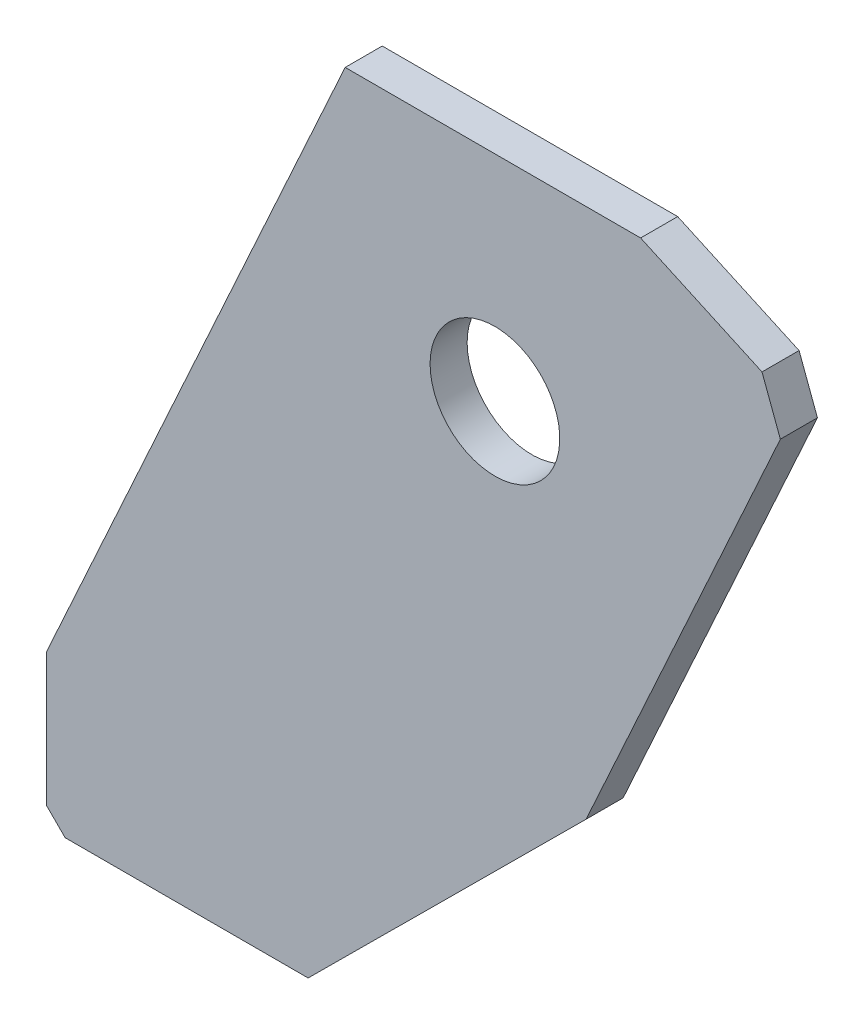
ISO-10303-21;
HEADER;
FILE_DESCRIPTION(('STEP AP214'),'2;1');
FILE_NAME('part.step','',(''),(''),'','','');
FILE_SCHEMA(('AUTOMOTIVE_DESIGN { 1 0 10303 214 1 1 1 1 }'));
ENDSEC;
DATA;
#1=APPLICATION_CONTEXT('core data for automotive mechanical design processes');
#2=APPLICATION_PROTOCOL_DEFINITION('international standard','automotive_design',2000,#1);
#3=PRODUCT_CONTEXT('',#1,'mechanical');
#4=PRODUCT('Part','Part','',(#3));
#5=PRODUCT_RELATED_PRODUCT_CATEGORY('part','',(#4));
#6=PRODUCT_DEFINITION_FORMATION('','',#4);
#7=PRODUCT_DEFINITION_CONTEXT('part definition',#1,'design');
#8=PRODUCT_DEFINITION('design','',#6,#7);
#9=PRODUCT_DEFINITION_SHAPE('','',#8);
#10=(LENGTH_UNIT() NAMED_UNIT(*) SI_UNIT(.MILLI.,.METRE.));
#11=(NAMED_UNIT(*) PLANE_ANGLE_UNIT() SI_UNIT($,.RADIAN.));
#12=(NAMED_UNIT(*) SI_UNIT($,.STERADIAN.) SOLID_ANGLE_UNIT());
#13=UNCERTAINTY_MEASURE_WITH_UNIT(LENGTH_MEASURE(1.E-05),#10,'distance_accuracy_value','');
#14=(GEOMETRIC_REPRESENTATION_CONTEXT(3) GLOBAL_UNCERTAINTY_ASSIGNED_CONTEXT((#13)) GLOBAL_UNIT_ASSIGNED_CONTEXT((#10,
#11,#12)) REPRESENTATION_CONTEXT('',''));
#15=CARTESIAN_POINT('',(0.,0.,0.));
#16=DIRECTION('',(0.,0.,1.));
#17=DIRECTION('',(1.,0.,0.));
#18=AXIS2_PLACEMENT_3D('',#15,#16,#17);
#19=CARTESIAN_POINT('',(-158.542296849365,-28.6070715600615,10.));
#20=DIRECTION('',(1.,0.,0.));
#21=DIRECTION('',(0.,1.,0.));
#22=AXIS2_PLACEMENT_3D('',#19,#20,#21);
#23=PLANE('',#22);
#24=DIRECTION('',(0.,-1.,0.));
#25=VECTOR('',#24,1.);
#26=CARTESIAN_POINT('',(-158.542296849365,-28.6070715600615,0.));
#27=LINE('',#26,#25);
#28=CARTESIAN_POINT('',(-158.542296849365,-28.6070715600615,0.));
#29=VERTEX_POINT('',#28);
#30=CARTESIAN_POINT('',(-158.542296849365,-64.6070715600615,0.));
#31=VERTEX_POINT('',#30);
#32=EDGE_CURVE('E133',#29,#31,#27,.T.);
#33=ORIENTED_EDGE('',*,*,#32,.T.);
#34=DIRECTION('',(0.,0.,-1.));
#35=VECTOR('',#34,1.);
#36=CARTESIAN_POINT('',(-158.542296849365,-64.6070715600615,10.));
#37=LINE('',#36,#35);
#38=CARTESIAN_POINT('',(-158.542296849365,-64.6070715600615,10.));
#39=VERTEX_POINT('',#38);
#40=EDGE_CURVE('E40',#39,#31,#37,.T.);
#41=ORIENTED_EDGE('',*,*,#40,.F.);
#42=DIRECTION('',(0.,-1.,0.));
#43=VECTOR('',#42,1.);
#44=CARTESIAN_POINT('',(-158.542296849365,-28.6070715600615,10.));
#45=LINE('',#44,#43);
#46=CARTESIAN_POINT('',(-158.542296849365,-28.6070715600615,10.));
#47=VERTEX_POINT('',#46);
#48=EDGE_CURVE('E91',#47,#39,#45,.T.);
#49=ORIENTED_EDGE('',*,*,#48,.F.);
#50=DIRECTION('',(0.,0.,-1.));
#51=VECTOR('',#50,1.);
#52=CARTESIAN_POINT('',(-158.542296849365,-28.6070715600615,10.));
#53=LINE('',#52,#51);
#54=EDGE_CURVE('E11',#47,#29,#53,.T.);
#55=ORIENTED_EDGE('',*,*,#54,.T.);
#56=EDGE_LOOP('',(#33,#41,#49,#55));
#57=FACE_BOUND('',#56,.T.);
#58=ADVANCED_FACE('F33',(#57),#23,.F.);
#59=CARTESIAN_POINT('',(-158.542296849365,-64.6070715600615,10.));
#60=DIRECTION('',(0.707106781186548,0.707106781186548,0.));
#61=DIRECTION('',(-0.707106781186548,0.707106781186548,0.));
#62=AXIS2_PLACEMENT_3D('',#59,#60,#61);
#63=PLANE('',#62);
#64=DIRECTION('',(0.707106781186547,-0.707106781186547,0.));
#65=VECTOR('',#64,1.);
#66=CARTESIAN_POINT('',(-158.542296849365,-64.6070715600615,0.));
#67=LINE('',#66,#65);
#68=CARTESIAN_POINT('',(-153.542296849365,-69.6070715600615,0.));
#69=VERTEX_POINT('',#68);
#70=EDGE_CURVE('E135',#31,#69,#67,.T.);
#71=ORIENTED_EDGE('',*,*,#70,.T.);
#72=DIRECTION('',(0.,0.,-1.));
#73=VECTOR('',#72,1.);
#74=CARTESIAN_POINT('',(-153.542296849365,-69.6070715600615,10.));
#75=LINE('',#74,#73);
#76=CARTESIAN_POINT('',(-153.542296849365,-69.6070715600615,10.));
#77=VERTEX_POINT('',#76);
#78=EDGE_CURVE('E152',#77,#69,#75,.T.);
#79=ORIENTED_EDGE('',*,*,#78,.F.);
#80=DIRECTION('',(0.707106781186547,-0.707106781186547,0.));
#81=VECTOR('',#80,1.);
#82=CARTESIAN_POINT('',(-158.542296849365,-64.6070715600615,10.));
#83=LINE('',#82,#81);
#84=EDGE_CURVE('E160',#39,#77,#83,.T.);
#85=ORIENTED_EDGE('',*,*,#84,.F.);
#86=ORIENTED_EDGE('',*,*,#40,.T.);
#87=EDGE_LOOP('',(#71,#79,#85,#86));
#88=FACE_BOUND('',#87,.T.);
#89=ADVANCED_FACE('F158',(#88),#63,.F.);
#90=CARTESIAN_POINT('',(-153.542296849365,-69.6070715600615,10.));
#91=DIRECTION('',(0.,1.,0.));
#92=DIRECTION('',(0.,0.,1.));
#93=AXIS2_PLACEMENT_3D('',#90,#91,#92);
#94=PLANE('',#93);
#95=DIRECTION('',(1.,0.,0.));
#96=VECTOR('',#95,1.);
#97=CARTESIAN_POINT('',(-153.542296849365,-69.6070715600615,0.));
#98=LINE('',#97,#96);
#99=CARTESIAN_POINT('',(-87.9543613891868,-69.6070715600615,0.));
#100=VERTEX_POINT('',#99);
#101=EDGE_CURVE('E138',#69,#100,#98,.T.);
#102=ORIENTED_EDGE('',*,*,#101,.T.);
#103=DIRECTION('',(0.,0.,-1.));
#104=VECTOR('',#103,1.);
#105=CARTESIAN_POINT('',(-87.9543613891868,-69.6070715600615,10.));
#106=LINE('',#105,#104);
#107=CARTESIAN_POINT('',(-87.9543613891868,-69.6070715600615,10.));
#108=VERTEX_POINT('',#107);
#109=EDGE_CURVE('E122',#108,#100,#106,.T.);
#110=ORIENTED_EDGE('',*,*,#109,.F.);
#111=DIRECTION('',(1.,0.,0.));
#112=VECTOR('',#111,1.);
#113=CARTESIAN_POINT('',(-153.542296849365,-69.6070715600615,10.));
#114=LINE('',#113,#112);
#115=EDGE_CURVE('E110',#77,#108,#114,.T.);
#116=ORIENTED_EDGE('',*,*,#115,.F.);
#117=ORIENTED_EDGE('',*,*,#78,.T.);
#118=EDGE_LOOP('',(#102,#110,#116,#117));
#119=FACE_BOUND('',#118,.T.);
#120=ADVANCED_FACE('F169',(#119),#94,.F.);
#121=CARTESIAN_POINT('',(-12.9366779558897,5.0022140777101,10.));
#122=DIRECTION('',(-0.705174149124853,0.709034145444378,0.));
#123=DIRECTION('',(-0.709034145444378,-0.705174149124853,0.));
#124=AXIS2_PLACEMENT_3D('',#121,#122,#123);
#125=PLANE('',#124);
#126=DIRECTION('',(0.709034145444378,0.705174149124853,0.));
#127=VECTOR('',#126,1.);
#128=CARTESIAN_POINT('',(-12.9366779558897,5.0022140777101,0.));
#129=LINE('',#128,#127);
#130=CARTESIAN_POINT('',(-12.9366779558897,5.0022140777101,0.));
#131=VERTEX_POINT('',#130);
#132=EDGE_CURVE('E119',#100,#131,#129,.T.);
#133=ORIENTED_EDGE('',*,*,#132,.T.);
#134=DIRECTION('',(0.,0.,-1.));
#135=VECTOR('',#134,1.);
#136=CARTESIAN_POINT('',(-12.9366779558897,5.0022140777101,10.));
#137=LINE('',#136,#135);
#138=CARTESIAN_POINT('',(-12.9366779558897,5.0022140777101,10.));
#139=VERTEX_POINT('',#138);
#140=EDGE_CURVE('E116',#139,#131,#137,.T.);
#141=ORIENTED_EDGE('',*,*,#140,.F.);
#142=DIRECTION('',(0.709034145444378,0.705174149124853,0.));
#143=VECTOR('',#142,1.);
#144=CARTESIAN_POINT('',(-12.9366779558897,5.0022140777101,10.));
#145=LINE('',#144,#143);
#146=EDGE_CURVE('E102',#108,#139,#145,.T.);
#147=ORIENTED_EDGE('',*,*,#146,.F.);
#148=ORIENTED_EDGE('',*,*,#109,.T.);
#149=EDGE_LOOP('',(#133,#141,#147,#148));
#150=FACE_BOUND('',#149,.T.);
#151=ADVANCED_FACE('F117',(#150),#125,.F.);
#152=CARTESIAN_POINT('',(-12.9366779558897,5.0022140777101,10.));
#153=DIRECTION('',(-0.90996127087654,0.414693242656246,0.));
#154=DIRECTION('',(-0.414693242656246,-0.90996127087654,0.));
#155=AXIS2_PLACEMENT_3D('',#152,#153,#154);
#156=PLANE('',#155);
#157=DIRECTION('',(0.414693242656246,0.90996127087654,0.));
#158=VECTOR('',#157,1.);
#159=CARTESIAN_POINT('',(-12.9366779558897,5.0022140777101,0.));
#160=LINE('',#159,#158);
#161=CARTESIAN_POINT('',(39.4952272454658,120.053529565513,0.));
#162=VERTEX_POINT('',#161);
#163=EDGE_CURVE('E141',#131,#162,#160,.T.);
#164=ORIENTED_EDGE('',*,*,#163,.T.);
#165=DIRECTION('',(0.,0.,-1.));
#166=VECTOR('',#165,1.);
#167=CARTESIAN_POINT('',(39.4952272454658,120.053529565513,10.));
#168=LINE('',#167,#166);
#169=CARTESIAN_POINT('',(39.4952272454658,120.053529565513,10.));
#170=VERTEX_POINT('',#169);
#171=EDGE_CURVE('E123',#170,#162,#168,.T.);
#172=ORIENTED_EDGE('',*,*,#171,.F.);
#173=DIRECTION('',(0.414693242656246,0.90996127087654,0.));
#174=VECTOR('',#173,1.);
#175=CARTESIAN_POINT('',(-12.9366779558897,5.0022140777101,10.));
#176=LINE('',#175,#174);
#177=EDGE_CURVE('E107',#139,#170,#176,.T.);
#178=ORIENTED_EDGE('',*,*,#177,.F.);
#179=ORIENTED_EDGE('',*,*,#140,.T.);
#180=EDGE_LOOP('',(#164,#172,#178,#179));
#181=FACE_BOUND('',#180,.T.);
#182=ADVANCED_FACE('F125',(#181),#156,.F.);
#183=CARTESIAN_POINT('',(39.4952272454658,120.053529565513,10.));
#184=DIRECTION('',(-0.9366721892484,-0.350207381259459,0.));
#185=DIRECTION('',(0.35020738125946,-0.936672189248401,0.));
#186=AXIS2_PLACEMENT_3D('',#183,#184,#185);
#187=PLANE('',#186);
#188=DIRECTION('',(-0.350207381259459,0.9366721892484,0.));
#189=VECTOR('',#188,1.);
#190=CARTESIAN_POINT('',(39.4952272454658,120.053529565513,0.));
#191=LINE('',#190,#189);
#192=CARTESIAN_POINT('',(34.5425469632628,133.300074700841,0.));
#193=VERTEX_POINT('',#192);
#194=EDGE_CURVE('E83',#162,#193,#191,.T.);
#195=ORIENTED_EDGE('',*,*,#194,.T.);
#196=DIRECTION('',(0.,0.,-1.));
#197=VECTOR('',#196,1.);
#198=CARTESIAN_POINT('',(34.5425469632628,133.300074700841,10.));
#199=LINE('',#198,#197);
#200=CARTESIAN_POINT('',(34.5425469632628,133.300074700841,10.));
#201=VERTEX_POINT('',#200);
#202=EDGE_CURVE('E148',#201,#193,#199,.T.);
#203=ORIENTED_EDGE('',*,*,#202,.F.);
#204=DIRECTION('',(-0.350207381259459,0.9366721892484,0.));
#205=VECTOR('',#204,1.);
#206=CARTESIAN_POINT('',(39.4952272454658,120.053529565513,10.));
#207=LINE('',#206,#205);
#208=EDGE_CURVE('E56',#170,#201,#207,.T.);
#209=ORIENTED_EDGE('',*,*,#208,.F.);
#210=ORIENTED_EDGE('',*,*,#171,.T.);
#211=EDGE_LOOP('',(#195,#203,#209,#210));
#212=FACE_BOUND('',#211,.T.);
#213=ADVANCED_FACE('F225',(#212),#187,.F.);
#214=CARTESIAN_POINT('',(34.5425469632628,133.300074700841,10.));
#215=DIRECTION('',(-0.41469324265625,-0.909961270876538,0.));
#216=DIRECTION('',(0.909961270876538,-0.41469324265625,0.));
#217=AXIS2_PLACEMENT_3D('',#214,#215,#216);
#218=PLANE('',#217);
#219=DIRECTION('',(-0.909961270876538,0.41469324265625,0.));
#220=VECTOR('',#219,1.);
#221=CARTESIAN_POINT('',(34.5425469632628,133.300074700841,0.));
#222=LINE('',#221,#220);
#223=CARTESIAN_POINT('',(1.78394121170766,148.229031436466,0.));
#224=VERTEX_POINT('',#223);
#225=EDGE_CURVE('E144',#193,#224,#222,.T.);
#226=ORIENTED_EDGE('',*,*,#225,.T.);
#227=DIRECTION('',(0.,0.,-1.));
#228=VECTOR('',#227,1.);
#229=CARTESIAN_POINT('',(1.78394121170766,148.229031436466,10.));
#230=LINE('',#229,#228);
#231=CARTESIAN_POINT('',(1.78394121170766,148.229031436466,10.));
#232=VERTEX_POINT('',#231);
#233=EDGE_CURVE('E132',#232,#224,#230,.T.);
#234=ORIENTED_EDGE('',*,*,#233,.F.);
#235=DIRECTION('',(-0.909961270876538,0.41469324265625,0.));
#236=VECTOR('',#235,1.);
#237=CARTESIAN_POINT('',(34.5425469632628,133.300074700841,10.));
#238=LINE('',#237,#236);
#239=EDGE_CURVE('E127',#201,#232,#238,.T.);
#240=ORIENTED_EDGE('',*,*,#239,.F.);
#241=ORIENTED_EDGE('',*,*,#202,.T.);
#242=EDGE_LOOP('',(#226,#234,#240,#241));
#243=FACE_BOUND('',#242,.T.);
#244=ADVANCED_FACE('F206',(#243),#218,.F.);
#245=CARTESIAN_POINT('',(0.,0.,10.));
#246=DIRECTION('',(0.,0.,1.));
#247=DIRECTION('',(1.,0.,0.));
#248=AXIS2_PLACEMENT_3D('',#245,#246,#247);
#249=PLANE('',#248);
#250=CARTESIAN_POINT('',(-37.5422968493655,90.3929284399385,10.));
#251=DIRECTION('',(0.,0.,-1.));
#252=DIRECTION('',(-1.,0.,0.));
#253=AXIS2_PLACEMENT_3D('',#250,#251,#252);
#254=CIRCLE('',#253,17.5);
#255=CARTESIAN_POINT('',(-55.0422968493655,90.3929284399385,10.));
#256=VERTEX_POINT('',#255);
#257=EDGE_CURVE('E181',#256,#256,#254,.T.);
#258=ORIENTED_EDGE('',*,*,#257,.T.);
#259=EDGE_LOOP('',(#258));
#260=FACE_BOUND('',#259,.T.);
#261=DIRECTION('',(1.,0.,0.));
#262=VECTOR('',#261,1.);
#263=CARTESIAN_POINT('',(1.78394121170766,148.229031436466,10.));
#264=LINE('',#263,#262);
#265=CARTESIAN_POINT('',(-77.953441787782,148.229031436466,10.));
#266=VERTEX_POINT('',#265);
#267=EDGE_CURVE('E174',#266,#232,#264,.T.);
#268=ORIENTED_EDGE('',*,*,#267,.F.);
#269=DIRECTION('',(0.414693242656246,0.90996127087654,0.));
#270=VECTOR('',#269,1.);
#271=CARTESIAN_POINT('',(-158.542296849365,-28.6070715600615,10.));
#272=LINE('',#271,#270);
#273=EDGE_CURVE('E178',#47,#266,#272,.T.);
#274=ORIENTED_EDGE('',*,*,#273,.F.);
#275=ORIENTED_EDGE('',*,*,#48,.T.);
#276=ORIENTED_EDGE('',*,*,#84,.T.);
#277=ORIENTED_EDGE('',*,*,#115,.T.);
#278=ORIENTED_EDGE('',*,*,#146,.T.);
#279=ORIENTED_EDGE('',*,*,#177,.T.);
#280=ORIENTED_EDGE('',*,*,#208,.T.);
#281=ORIENTED_EDGE('',*,*,#239,.T.);
#282=EDGE_LOOP('',(#268,#274,#275,#276,#277,#278,#279,#280,#281));
#283=FACE_BOUND('',#282,.T.);
#284=ADVANCED_FACE('F105',(#260,#283),#249,.T.);
#285=CARTESIAN_POINT('',(0.,0.,0.));
#286=DIRECTION('',(0.,0.,1.));
#287=DIRECTION('',(1.,0.,0.));
#288=AXIS2_PLACEMENT_3D('',#285,#286,#287);
#289=PLANE('',#288);
#290=CARTESIAN_POINT('',(-37.5422968493655,90.3929284399385,0.));
#291=DIRECTION('',(0.,0.,-1.));
#292=DIRECTION('',(-1.,0.,0.));
#293=AXIS2_PLACEMENT_3D('',#290,#291,#292);
#294=CIRCLE('',#293,17.5);
#295=CARTESIAN_POINT('',(-55.0422968493655,90.3929284399385,0.));
#296=VERTEX_POINT('',#295);
#297=EDGE_CURVE('E184',#296,#296,#294,.T.);
#298=ORIENTED_EDGE('',*,*,#297,.F.);
#299=EDGE_LOOP('',(#298));
#300=FACE_BOUND('',#299,.T.);
#301=DIRECTION('',(0.414693242656246,0.90996127087654,0.));
#302=VECTOR('',#301,1.);
#303=CARTESIAN_POINT('',(-158.542296849365,-28.6070715600615,0.));
#304=LINE('',#303,#302);
#305=CARTESIAN_POINT('',(-77.9534417877821,148.229031436466,0.));
#306=VERTEX_POINT('',#305);
#307=EDGE_CURVE('E177',#29,#306,#304,.T.);
#308=ORIENTED_EDGE('',*,*,#307,.T.);
#309=DIRECTION('',(1.,0.,0.));
#310=VECTOR('',#309,1.);
#311=CARTESIAN_POINT('',(1.78394121170766,148.229031436466,0.));
#312=LINE('',#311,#310);
#313=EDGE_CURVE('E47',#306,#224,#312,.T.);
#314=ORIENTED_EDGE('',*,*,#313,.T.);
#315=ORIENTED_EDGE('',*,*,#225,.F.);
#316=ORIENTED_EDGE('',*,*,#194,.F.);
#317=ORIENTED_EDGE('',*,*,#163,.F.);
#318=ORIENTED_EDGE('',*,*,#132,.F.);
#319=ORIENTED_EDGE('',*,*,#101,.F.);
#320=ORIENTED_EDGE('',*,*,#70,.F.);
#321=ORIENTED_EDGE('',*,*,#32,.F.);
#322=EDGE_LOOP('',(#308,#314,#315,#316,#317,#318,#319,#320,#321));
#323=FACE_BOUND('',#322,.T.);
#324=ADVANCED_FACE('F166',(#300,#323),#289,.F.);
#325=CARTESIAN_POINT('',(1.78394121170766,148.229031436466,0.));
#326=DIRECTION('',(0.,-1.,0.));
#327=DIRECTION('',(0.,0.,-1.));
#328=AXIS2_PLACEMENT_3D('',#325,#326,#327);
#329=PLANE('',#328);
#330=ORIENTED_EDGE('',*,*,#267,.T.);
#331=ORIENTED_EDGE('',*,*,#233,.T.);
#332=ORIENTED_EDGE('',*,*,#313,.F.);
#333=DIRECTION('',(0.,0.,1.));
#334=VECTOR('',#333,1.);
#335=CARTESIAN_POINT('',(-77.953441787782,148.229031436466,0.));
#336=LINE('',#335,#334);
#337=EDGE_CURVE('E136',#306,#266,#336,.T.);
#338=ORIENTED_EDGE('',*,*,#337,.T.);
#339=EDGE_LOOP('',(#330,#331,#332,#338));
#340=FACE_BOUND('',#339,.T.);
#341=ADVANCED_FACE('F199',(#340),#329,.F.);
#342=CARTESIAN_POINT('',(-158.542296849365,-28.6070715600615,0.));
#343=DIRECTION('',(0.90996127087654,-0.414693242656246,0.));
#344=DIRECTION('',(0.414693242656246,0.90996127087654,0.));
#345=AXIS2_PLACEMENT_3D('',#342,#343,#344);
#346=PLANE('',#345);
#347=ORIENTED_EDGE('',*,*,#273,.T.);
#348=ORIENTED_EDGE('',*,*,#337,.F.);
#349=ORIENTED_EDGE('',*,*,#307,.F.);
#350=ORIENTED_EDGE('',*,*,#54,.F.);
#351=EDGE_LOOP('',(#347,#348,#349,#350));
#352=FACE_BOUND('',#351,.T.);
#353=ADVANCED_FACE('F194',(#352),#346,.F.);
#354=CARTESIAN_POINT('',(-37.5422968493655,90.3929284399385,10.));
#355=DIRECTION('',(0.,0.,-1.));
#356=DIRECTION('',(-1.,0.,0.));
#357=AXIS2_PLACEMENT_3D('',#354,#355,#356);
#358=CYLINDRICAL_SURFACE('',#357,17.5);
#359=ORIENTED_EDGE('',*,*,#257,.F.);
#360=EDGE_LOOP('',(#359));
#361=FACE_BOUND('',#360,.T.);
#362=ORIENTED_EDGE('',*,*,#297,.T.);
#363=EDGE_LOOP('',(#362));
#364=FACE_BOUND('',#363,.T.);
#365=ADVANCED_FACE('F191',(#361,#364),#358,.F.);
#366=CLOSED_SHELL('',(#58,#89,#120,#151,#182,#213,#244,#284,#324,#341,#353,#365));
#367=MANIFOLD_SOLID_BREP('B2',#366);
#368=ADVANCED_BREP_SHAPE_REPRESENTATION('',(#18,#367),#14);
#369=SHAPE_DEFINITION_REPRESENTATION(#9,#368);
ENDSEC;
END-ISO-10303-21;
